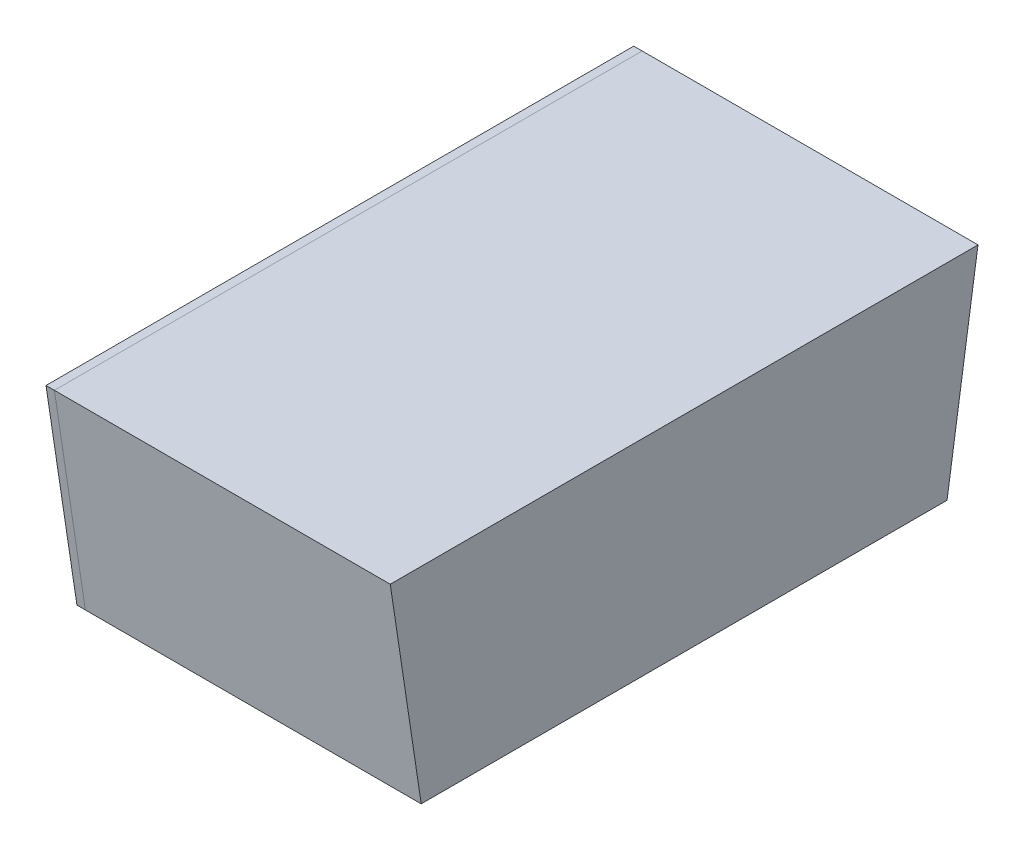
ISO-10303-21;
HEADER;
FILE_DESCRIPTION(('STEP AP214'),'2;1');
FILE_NAME('part.step','',(''),(''),'','','');
FILE_SCHEMA(('AUTOMOTIVE_DESIGN { 1 0 10303 214 1 1 1 1 }'));
ENDSEC;
DATA;
#1=APPLICATION_CONTEXT('core data for automotive mechanical design processes');
#2=APPLICATION_PROTOCOL_DEFINITION('international standard','automotive_design',2000,#1);
#3=PRODUCT_CONTEXT('',#1,'mechanical');
#4=PRODUCT('Part','Part','',(#3));
#5=PRODUCT_RELATED_PRODUCT_CATEGORY('part','',(#4));
#6=PRODUCT_DEFINITION_FORMATION('','',#4);
#7=PRODUCT_DEFINITION_CONTEXT('part definition',#1,'design');
#8=PRODUCT_DEFINITION('design','',#6,#7);
#9=PRODUCT_DEFINITION_SHAPE('','',#8);
#10=(LENGTH_UNIT() NAMED_UNIT(*) SI_UNIT(.MILLI.,.METRE.));
#11=(NAMED_UNIT(*) PLANE_ANGLE_UNIT() SI_UNIT($,.RADIAN.));
#12=(NAMED_UNIT(*) SI_UNIT($,.STERADIAN.) SOLID_ANGLE_UNIT());
#13=UNCERTAINTY_MEASURE_WITH_UNIT(LENGTH_MEASURE(1.E-05),#10,'distance_accuracy_value','');
#14=(GEOMETRIC_REPRESENTATION_CONTEXT(3) GLOBAL_UNCERTAINTY_ASSIGNED_CONTEXT((#13)) GLOBAL_UNIT_ASSIGNED_CONTEXT((#10,
#11,#12)) REPRESENTATION_CONTEXT('',''));
#15=CARTESIAN_POINT('',(0.,0.,0.));
#16=DIRECTION('',(0.,0.,1.));
#17=DIRECTION('',(1.,0.,0.));
#18=AXIS2_PLACEMENT_3D('',#15,#16,#17);
#19=CARTESIAN_POINT('',(-6.35,317.48,-421.1));
#20=DIRECTION('',(0.,0.148741411251984,0.988876126003034));
#21=DIRECTION('',(0.,-0.988876126003034,0.148741411251984));
#22=AXIS2_PLACEMENT_3D('',#19,#20,#21);
#23=PLANE('',#22);
#24=DIRECTION('',(0.,-0.988876126003034,0.148741411251984));
#25=VECTOR('',#24,1.);
#26=CARTESIAN_POINT('',(0.,317.48,-421.1));
#27=LINE('',#26,#25);
#28=CARTESIAN_POINT('',(0.,317.48,-421.1));
#29=VERTEX_POINT('',#28);
#30=CARTESIAN_POINT('',(0.,161.91,-397.7));
#31=VERTEX_POINT('',#30);
#32=EDGE_CURVE('E105',#29,#31,#27,.T.);
#33=ORIENTED_EDGE('',*,*,#32,.T.);
#34=DIRECTION('',(1.,0.,0.));
#35=VECTOR('',#34,1.);
#36=CARTESIAN_POINT('',(-6.35,161.91,-397.7));
#37=LINE('',#36,#35);
#38=CARTESIAN_POINT('',(-6.35,161.91,-397.7));
#39=VERTEX_POINT('',#38);
#40=EDGE_CURVE('E12',#39,#31,#37,.T.);
#41=ORIENTED_EDGE('',*,*,#40,.F.);
#42=DIRECTION('',(0.,-0.988876126003034,0.148741411251984));
#43=VECTOR('',#42,1.);
#44=CARTESIAN_POINT('',(-6.35,317.48,-421.1));
#45=LINE('',#44,#43);
#46=CARTESIAN_POINT('',(-6.35,317.48,-421.1));
#47=VERTEX_POINT('',#46);
#48=EDGE_CURVE('E93',#47,#39,#45,.T.);
#49=ORIENTED_EDGE('',*,*,#48,.F.);
#50=DIRECTION('',(1.,0.,0.));
#51=VECTOR('',#50,1.);
#52=CARTESIAN_POINT('',(-6.35,317.48,-421.1));
#53=LINE('',#52,#51);
#54=EDGE_CURVE('E101',#47,#29,#53,.T.);
#55=ORIENTED_EDGE('',*,*,#54,.T.);
#56=EDGE_LOOP('',(#33,#41,#49,#55));
#57=FACE_BOUND('',#56,.T.);
#58=ADVANCED_FACE('F42',(#57),#23,.F.);
#59=CARTESIAN_POINT('',(-6.35,161.91,-397.7));
#60=DIRECTION('',(0.,1.,0.));
#61=DIRECTION('',(0.,0.,1.));
#62=AXIS2_PLACEMENT_3D('',#59,#60,#61);
#63=PLANE('',#62);
#64=DIRECTION('',(0.,0.,1.));
#65=VECTOR('',#64,1.);
#66=CARTESIAN_POINT('',(0.,161.91,-397.7));
#67=LINE('',#66,#65);
#68=CARTESIAN_POINT('',(0.,161.91,0.));
#69=VERTEX_POINT('',#68);
#70=EDGE_CURVE('E97',#31,#69,#67,.T.);
#71=ORIENTED_EDGE('',*,*,#70,.T.);
#72=DIRECTION('',(1.,0.,0.));
#73=VECTOR('',#72,1.);
#74=CARTESIAN_POINT('',(-6.35,161.91,0.));
#75=LINE('',#74,#73);
#76=CARTESIAN_POINT('',(-6.35,161.91,0.));
#77=VERTEX_POINT('',#76);
#78=EDGE_CURVE('E50',#77,#69,#75,.T.);
#79=ORIENTED_EDGE('',*,*,#78,.F.);
#80=DIRECTION('',(0.,0.,1.));
#81=VECTOR('',#80,1.);
#82=CARTESIAN_POINT('',(-6.35,161.91,-397.7));
#83=LINE('',#82,#81);
#84=EDGE_CURVE('E88',#39,#77,#83,.T.);
#85=ORIENTED_EDGE('',*,*,#84,.F.);
#86=ORIENTED_EDGE('',*,*,#40,.T.);
#87=EDGE_LOOP('',(#71,#79,#85,#86));
#88=FACE_BOUND('',#87,.T.);
#89=ADVANCED_FACE('F96',(#88),#63,.F.);
#90=CARTESIAN_POINT('',(-6.35,161.91,0.));
#91=DIRECTION('',(0.,0.148741411251983,-0.988876126003034));
#92=DIRECTION('',(0.,0.988876126003034,0.148741411251983));
#93=AXIS2_PLACEMENT_3D('',#90,#91,#92);
#94=PLANE('',#93);
#95=DIRECTION('',(0.,0.988876126003034,0.148741411251983));
#96=VECTOR('',#95,1.);
#97=CARTESIAN_POINT('',(0.,161.91,0.));
#98=LINE('',#97,#96);
#99=CARTESIAN_POINT('',(0.,317.48,23.4));
#100=VERTEX_POINT('',#99);
#101=EDGE_CURVE('E75',#69,#100,#98,.T.);
#102=ORIENTED_EDGE('',*,*,#101,.T.);
#103=DIRECTION('',(1.,0.,0.));
#104=VECTOR('',#103,1.);
#105=CARTESIAN_POINT('',(-6.35,317.48,23.4));
#106=LINE('',#105,#104);
#107=CARTESIAN_POINT('',(-6.35,317.48,23.4));
#108=VERTEX_POINT('',#107);
#109=EDGE_CURVE('E98',#108,#100,#106,.T.);
#110=ORIENTED_EDGE('',*,*,#109,.F.);
#111=DIRECTION('',(0.,0.988876126003034,0.148741411251983));
#112=VECTOR('',#111,1.);
#113=CARTESIAN_POINT('',(-6.35,161.91,0.));
#114=LINE('',#113,#112);
#115=EDGE_CURVE('E91',#77,#108,#114,.T.);
#116=ORIENTED_EDGE('',*,*,#115,.F.);
#117=ORIENTED_EDGE('',*,*,#78,.T.);
#118=EDGE_LOOP('',(#102,#110,#116,#117));
#119=FACE_BOUND('',#118,.T.);
#120=ADVANCED_FACE('F99',(#119),#94,.F.);
#121=CARTESIAN_POINT('',(-6.35,317.48,23.4));
#122=DIRECTION('',(0.,-1.,0.));
#123=DIRECTION('',(0.,0.,-1.));
#124=AXIS2_PLACEMENT_3D('',#121,#122,#123);
#125=PLANE('',#124);
#126=DIRECTION('',(0.,0.,-1.));
#127=VECTOR('',#126,1.);
#128=CARTESIAN_POINT('',(0.,317.48,23.4));
#129=LINE('',#128,#127);
#130=EDGE_CURVE('E81',#100,#29,#129,.T.);
#131=ORIENTED_EDGE('',*,*,#130,.T.);
#132=ORIENTED_EDGE('',*,*,#54,.F.);
#133=DIRECTION('',(0.,0.,-1.));
#134=VECTOR('',#133,1.);
#135=CARTESIAN_POINT('',(-6.35,317.48,23.4));
#136=LINE('',#135,#134);
#137=EDGE_CURVE('E58',#108,#47,#136,.T.);
#138=ORIENTED_EDGE('',*,*,#137,.F.);
#139=ORIENTED_EDGE('',*,*,#109,.T.);
#140=EDGE_LOOP('',(#131,#132,#138,#139));
#141=FACE_BOUND('',#140,.T.);
#142=ADVANCED_FACE('F112',(#141),#125,.F.);
#143=CARTESIAN_POINT('',(-6.35,0.,0.));
#144=DIRECTION('',(-1.,0.,0.));
#145=DIRECTION('',(0.,0.,1.));
#146=AXIS2_PLACEMENT_3D('',#143,#144,#145);
#147=PLANE('',#146);
#148=ORIENTED_EDGE('',*,*,#48,.T.);
#149=ORIENTED_EDGE('',*,*,#84,.T.);
#150=ORIENTED_EDGE('',*,*,#115,.T.);
#151=ORIENTED_EDGE('',*,*,#137,.T.);
#152=EDGE_LOOP('',(#148,#149,#150,#151));
#153=FACE_BOUND('',#152,.T.);
#154=ADVANCED_FACE('F89',(#153),#147,.T.);
#155=CARTESIAN_POINT('',(0.,0.,0.));
#156=DIRECTION('',(-1.,0.,0.));
#157=DIRECTION('',(0.,0.,1.));
#158=AXIS2_PLACEMENT_3D('',#155,#156,#157);
#159=PLANE('',#158);
#160=ORIENTED_EDGE('',*,*,#32,.F.);
#161=ORIENTED_EDGE('',*,*,#130,.F.);
#162=ORIENTED_EDGE('',*,*,#101,.F.);
#163=ORIENTED_EDGE('',*,*,#70,.F.);
#164=EDGE_LOOP('',(#160,#161,#162,#163));
#165=FACE_BOUND('',#164,.T.);
#166=ADVANCED_FACE('F115',(#165),#159,.F.);
#167=CLOSED_SHELL('',(#58,#89,#120,#142,#154,#166));
#168=MANIFOLD_SOLID_BREP('B2',#167);
#169=CARTESIAN_POINT('',(254.,161.91,-397.7));
#170=DIRECTION('',(0.,1.,0.));
#171=DIRECTION('',(0.,0.,1.));
#172=AXIS2_PLACEMENT_3D('',#169,#170,#171);
#173=PLANE('',#172);
#174=DIRECTION('',(0.,0.,-1.));
#175=VECTOR('',#174,1.);
#176=CARTESIAN_POINT('',(0.,161.91,-397.7));
#177=LINE('',#176,#175);
#178=CARTESIAN_POINT('',(0.,161.91,0.));
#179=VERTEX_POINT('',#178);
#180=CARTESIAN_POINT('',(0.,161.91,-397.7));
#181=VERTEX_POINT('',#180);
#182=EDGE_CURVE('E228',#179,#181,#177,.T.);
#183=ORIENTED_EDGE('',*,*,#182,.T.);
#184=DIRECTION('',(-1.,0.,0.));
#185=VECTOR('',#184,1.);
#186=CARTESIAN_POINT('',(254.,161.91,-397.7));
#187=LINE('',#186,#185);
#188=CARTESIAN_POINT('',(254.,161.91,-397.7));
#189=VERTEX_POINT('',#188);
#190=EDGE_CURVE('E40',#189,#181,#187,.T.);
#191=ORIENTED_EDGE('',*,*,#190,.F.);
#192=DIRECTION('',(0.,0.,-1.));
#193=VECTOR('',#192,1.);
#194=CARTESIAN_POINT('',(254.,161.91,-397.7));
#195=LINE('',#194,#193);
#196=CARTESIAN_POINT('',(254.,161.91,0.));
#197=VERTEX_POINT('',#196);
#198=EDGE_CURVE('E216',#197,#189,#195,.T.);
#199=ORIENTED_EDGE('',*,*,#198,.F.);
#200=DIRECTION('',(-1.,0.,0.));
#201=VECTOR('',#200,1.);
#202=CARTESIAN_POINT('',(254.,161.91,0.));
#203=LINE('',#202,#201);
#204=EDGE_CURVE('E224',#197,#179,#203,.T.);
#205=ORIENTED_EDGE('',*,*,#204,.T.);
#206=EDGE_LOOP('',(#183,#191,#199,#205));
#207=FACE_BOUND('',#206,.T.);
#208=ADVANCED_FACE('F165',(#207),#173,.F.);
#209=CARTESIAN_POINT('',(254.,317.48,-421.1));
#210=DIRECTION('',(0.,0.148741411251984,0.988876126003034));
#211=DIRECTION('',(0.,-0.988876126003034,0.148741411251984));
#212=AXIS2_PLACEMENT_3D('',#209,#210,#211);
#213=PLANE('',#212);
#214=DIRECTION('',(0.,0.988876126003034,-0.148741411251984));
#215=VECTOR('',#214,1.);
#216=CARTESIAN_POINT('',(0.,317.48,-421.1));
#217=LINE('',#216,#215);
#218=CARTESIAN_POINT('',(0.,317.48,-421.1));
#219=VERTEX_POINT('',#218);
#220=EDGE_CURVE('E220',#181,#219,#217,.T.);
#221=ORIENTED_EDGE('',*,*,#220,.T.);
#222=DIRECTION('',(-1.,0.,0.));
#223=VECTOR('',#222,1.);
#224=CARTESIAN_POINT('',(254.,317.48,-421.1));
#225=LINE('',#224,#223);
#226=CARTESIAN_POINT('',(254.,317.48,-421.1));
#227=VERTEX_POINT('',#226);
#228=EDGE_CURVE('E173',#227,#219,#225,.T.);
#229=ORIENTED_EDGE('',*,*,#228,.F.);
#230=DIRECTION('',(0.,0.988876126003034,-0.148741411251984));
#231=VECTOR('',#230,1.);
#232=CARTESIAN_POINT('',(254.,317.48,-421.1));
#233=LINE('',#232,#231);
#234=EDGE_CURVE('E211',#189,#227,#233,.T.);
#235=ORIENTED_EDGE('',*,*,#234,.F.);
#236=ORIENTED_EDGE('',*,*,#190,.T.);
#237=EDGE_LOOP('',(#221,#229,#235,#236));
#238=FACE_BOUND('',#237,.T.);
#239=ADVANCED_FACE('F219',(#238),#213,.F.);
#240=CARTESIAN_POINT('',(254.,317.48,23.4));
#241=DIRECTION('',(0.,-1.,0.));
#242=DIRECTION('',(0.,0.,-1.));
#243=AXIS2_PLACEMENT_3D('',#240,#241,#242);
#244=PLANE('',#243);
#245=DIRECTION('',(0.,0.,1.));
#246=VECTOR('',#245,1.);
#247=CARTESIAN_POINT('',(0.,317.48,23.4));
#248=LINE('',#247,#246);
#249=CARTESIAN_POINT('',(0.,317.48,23.4));
#250=VERTEX_POINT('',#249);
#251=EDGE_CURVE('E198',#219,#250,#248,.T.);
#252=ORIENTED_EDGE('',*,*,#251,.T.);
#253=DIRECTION('',(-1.,0.,0.));
#254=VECTOR('',#253,1.);
#255=CARTESIAN_POINT('',(254.,317.48,23.4));
#256=LINE('',#255,#254);
#257=CARTESIAN_POINT('',(254.,317.48,23.4));
#258=VERTEX_POINT('',#257);
#259=EDGE_CURVE('E221',#258,#250,#256,.T.);
#260=ORIENTED_EDGE('',*,*,#259,.F.);
#261=DIRECTION('',(0.,0.,1.));
#262=VECTOR('',#261,1.);
#263=CARTESIAN_POINT('',(254.,317.48,23.4));
#264=LINE('',#263,#262);
#265=EDGE_CURVE('E214',#227,#258,#264,.T.);
#266=ORIENTED_EDGE('',*,*,#265,.F.);
#267=ORIENTED_EDGE('',*,*,#228,.T.);
#268=EDGE_LOOP('',(#252,#260,#266,#267));
#269=FACE_BOUND('',#268,.T.);
#270=ADVANCED_FACE('F222',(#269),#244,.F.);
#271=CARTESIAN_POINT('',(254.,161.91,0.));
#272=DIRECTION('',(0.,0.148741411251983,-0.988876126003034));
#273=DIRECTION('',(0.,0.988876126003034,0.148741411251983));
#274=AXIS2_PLACEMENT_3D('',#271,#272,#273);
#275=PLANE('',#274);
#276=DIRECTION('',(0.,-0.988876126003034,-0.148741411251983));
#277=VECTOR('',#276,1.);
#278=CARTESIAN_POINT('',(0.,161.91,0.));
#279=LINE('',#278,#277);
#280=EDGE_CURVE('E204',#250,#179,#279,.T.);
#281=ORIENTED_EDGE('',*,*,#280,.T.);
#282=ORIENTED_EDGE('',*,*,#204,.F.);
#283=DIRECTION('',(0.,-0.988876126003034,-0.148741411251983));
#284=VECTOR('',#283,1.);
#285=CARTESIAN_POINT('',(254.,161.91,0.));
#286=LINE('',#285,#284);
#287=EDGE_CURVE('E181',#258,#197,#286,.T.);
#288=ORIENTED_EDGE('',*,*,#287,.F.);
#289=ORIENTED_EDGE('',*,*,#259,.T.);
#290=EDGE_LOOP('',(#281,#282,#288,#289));
#291=FACE_BOUND('',#290,.T.);
#292=ADVANCED_FACE('F235',(#291),#275,.F.);
#293=CARTESIAN_POINT('',(254.,0.,0.));
#294=DIRECTION('',(-1.,0.,0.));
#295=DIRECTION('',(0.,0.,1.));
#296=AXIS2_PLACEMENT_3D('',#293,#294,#295);
#297=PLANE('',#296);
#298=ORIENTED_EDGE('',*,*,#198,.T.);
#299=ORIENTED_EDGE('',*,*,#234,.T.);
#300=ORIENTED_EDGE('',*,*,#265,.T.);
#301=ORIENTED_EDGE('',*,*,#287,.T.);
#302=EDGE_LOOP('',(#298,#299,#300,#301));
#303=FACE_BOUND('',#302,.T.);
#304=ADVANCED_FACE('F212',(#303),#297,.F.);
#305=CARTESIAN_POINT('',(0.,0.,0.));
#306=DIRECTION('',(-1.,0.,0.));
#307=DIRECTION('',(0.,0.,1.));
#308=AXIS2_PLACEMENT_3D('',#305,#306,#307);
#309=PLANE('',#308);
#310=ORIENTED_EDGE('',*,*,#182,.F.);
#311=ORIENTED_EDGE('',*,*,#280,.F.);
#312=ORIENTED_EDGE('',*,*,#251,.F.);
#313=ORIENTED_EDGE('',*,*,#220,.F.);
#314=EDGE_LOOP('',(#310,#311,#312,#313));
#315=FACE_BOUND('',#314,.T.);
#316=ADVANCED_FACE('F238',(#315),#309,.T.);
#317=CLOSED_SHELL('',(#208,#239,#270,#292,#304,#316));
#318=MANIFOLD_SOLID_BREP('B6',#317);
#319=ADVANCED_BREP_SHAPE_REPRESENTATION('',(#18,#168,#318),#14);
#320=SHAPE_DEFINITION_REPRESENTATION(#9,#319);
ENDSEC;
END-ISO-10303-21;
